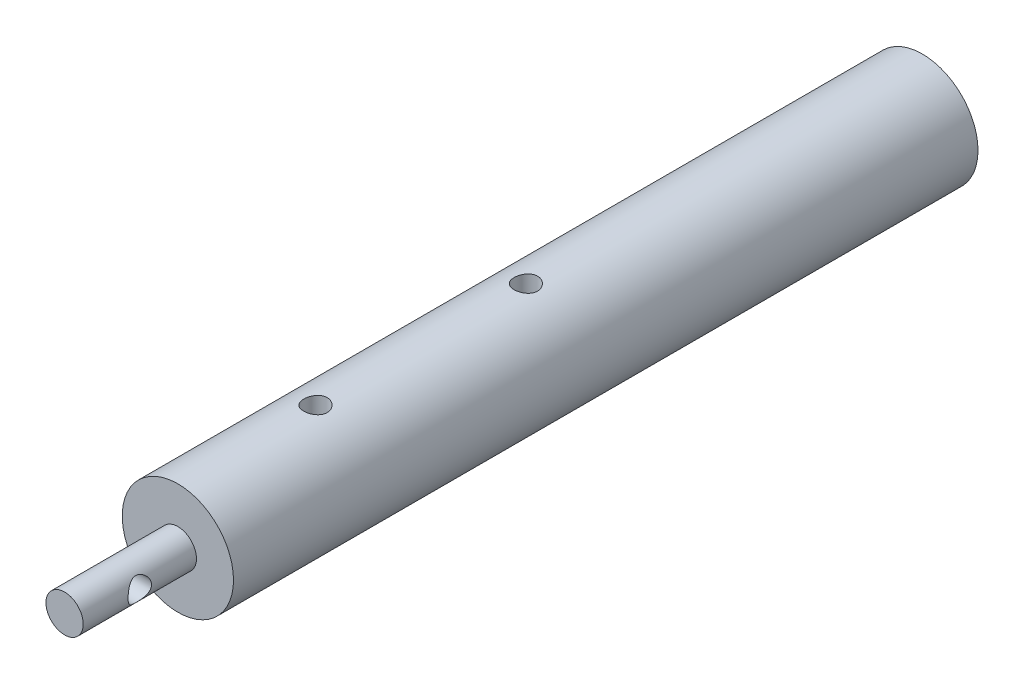
ISO-10303-21;
HEADER;
FILE_DESCRIPTION(('STEP AP214'),'2;1');
FILE_NAME('part.step','',(''),(''),'','','');
FILE_SCHEMA(('AUTOMOTIVE_DESIGN { 1 0 10303 214 1 1 1 1 }'));
ENDSEC;
DATA;
#1=APPLICATION_CONTEXT('core data for automotive mechanical design processes');
#2=APPLICATION_PROTOCOL_DEFINITION('international standard','automotive_design',2000,#1);
#3=PRODUCT_CONTEXT('',#1,'mechanical');
#4=PRODUCT('Part','Part','',(#3));
#5=PRODUCT_RELATED_PRODUCT_CATEGORY('part','',(#4));
#6=PRODUCT_DEFINITION_FORMATION('','',#4);
#7=PRODUCT_DEFINITION_CONTEXT('part definition',#1,'design');
#8=PRODUCT_DEFINITION('design','',#6,#7);
#9=PRODUCT_DEFINITION_SHAPE('','',#8);
#10=(LENGTH_UNIT() NAMED_UNIT(*) SI_UNIT(.MILLI.,.METRE.));
#11=(NAMED_UNIT(*) PLANE_ANGLE_UNIT() SI_UNIT($,.RADIAN.));
#12=(NAMED_UNIT(*) SI_UNIT($,.STERADIAN.) SOLID_ANGLE_UNIT());
#13=UNCERTAINTY_MEASURE_WITH_UNIT(LENGTH_MEASURE(1.E-05),#10,'distance_accuracy_value','');
#14=(GEOMETRIC_REPRESENTATION_CONTEXT(3) GLOBAL_UNCERTAINTY_ASSIGNED_CONTEXT((#13)) GLOBAL_UNIT_ASSIGNED_CONTEXT((#10,
#11,#12)) REPRESENTATION_CONTEXT('',''));
#15=CARTESIAN_POINT('',(0.,0.,0.));
#16=DIRECTION('',(0.,0.,1.));
#17=DIRECTION('',(1.,0.,0.));
#18=AXIS2_PLACEMENT_3D('',#15,#16,#17);
#19=CARTESIAN_POINT('',(0.,0.,116.84));
#20=DIRECTION('',(0.,0.,-1.));
#21=DIRECTION('',(-1.,0.,0.));
#22=AXIS2_PLACEMENT_3D('',#19,#20,#21);
#23=CYLINDRICAL_SURFACE('',#22,8.73125);
#24=CARTESIAN_POINT('',(0.,-8.73125,64.0715));
#25=CARTESIAN_POINT('',(0.102224418980661,-8.73124810767345,64.0714963883452));
#26=CARTESIAN_POINT('',(0.204493324141475,-8.72943643184458,64.0629593058333));
#27=CARTESIAN_POINT('',(0.406132282969961,-8.72238417957108,64.0290684180449));
#28=CARTESIAN_POINT('',(0.505500107960738,-8.7171410358242,64.003702021479));
#29=CARTESIAN_POINT('',(0.698393117145374,-8.70381035477737,63.9369775265614));
#30=CARTESIAN_POINT('',(0.791924078911132,-8.69572568446575,63.8956355427818));
#31=CARTESIAN_POINT('',(0.970717513249947,-8.67758720821655,63.7981831932263));
#32=CARTESIAN_POINT('',(1.05598031771531,-8.66753348136788,63.7420734205807));
#33=CARTESIAN_POINT('',(1.21709893146464,-8.64639208160256,63.6157881310304));
#34=CARTESIAN_POINT('',(1.292813111792,-8.63529234170806,63.5454339231176));
#35=CARTESIAN_POINT('',(1.43145789776887,-8.61339612215577,63.3930407018612));
#36=CARTESIAN_POINT('',(1.49438742595083,-8.6025996681244,63.3110007046506));
#37=CARTESIAN_POINT('',(1.60629202240899,-8.58241397100292,63.1365296780583));
#38=CARTESIAN_POINT('',(1.65511807798338,-8.57304021861435,63.0440011212156));
#39=CARTESIAN_POINT('',(1.73647441961172,-8.55693370414506,62.8518224511457));
#40=CARTESIAN_POINT('',(1.7690065079655,-8.55020064999067,62.7521731269511));
#41=CARTESIAN_POINT('',(1.8163869073972,-8.5402604397764,62.550112670628));
#42=CARTESIAN_POINT('',(1.83148501994123,-8.53700352874128,62.4477626124957));
#43=CARTESIAN_POINT('',(1.84434526749937,-8.53423479739085,62.2419343585075));
#44=CARTESIAN_POINT('',(1.84210937910246,-8.53472255007301,62.1384562926217));
#45=CARTESIAN_POINT('',(1.8205665209328,-8.53934292180432,61.9351537628666));
#46=CARTESIAN_POINT('',(1.80154809109239,-8.54341393140987,61.8352971130801));
#47=CARTESIAN_POINT('',(1.74743642668265,-8.5546448812519,61.6402243992061));
#48=CARTESIAN_POINT('',(1.71234234733093,-8.5618049838204,61.5450085792873));
#49=CARTESIAN_POINT('',(1.62680613418456,-8.57846904041817,61.3611004972115));
#50=CARTESIAN_POINT('',(1.57625159508328,-8.58799006026289,61.2724621256921));
#51=CARTESIAN_POINT('',(1.46130867134572,-8.60829249964807,61.1048193075035));
#52=CARTESIAN_POINT('',(1.39691852692361,-8.61907407944275,61.0258160883595));
#53=CARTESIAN_POINT('',(1.25459731805001,-8.64094827123213,60.8780233503252));
#54=CARTESIAN_POINT('',(1.176420502819,-8.65204278364511,60.8094705469998));
#55=CARTESIAN_POINT('',(1.0095565967994,-8.67309532179032,60.6864118575011));
#56=CARTESIAN_POINT('',(0.920869340681758,-8.68305332964051,60.6319061923317));
#57=CARTESIAN_POINT('',(0.735224260155671,-8.70073970366194,60.538436832276));
#58=CARTESIAN_POINT('',(0.638251245594517,-8.70846385578048,60.4995024595499));
#59=CARTESIAN_POINT('',(0.438940760989118,-8.72078063834335,60.4385454706627));
#60=CARTESIAN_POINT('',(0.33660401710987,-8.72537369151622,60.4165205715091));
#61=CARTESIAN_POINT('',(0.131503090262895,-8.73085114846451,60.3903481091019));
#62=CARTESIAN_POINT('',(0.0287819416933287,-8.73180267590541,60.3858769403062));
#63=CARTESIAN_POINT('',(-0.175939518626164,-8.73007726004999,60.3940641406405));
#64=CARTESIAN_POINT('',(-0.277939875261671,-8.72740054473136,60.4067214335173));
#65=CARTESIAN_POINT('',(-0.477264200163102,-8.71876160956828,60.448537684106));
#66=CARTESIAN_POINT('',(-0.574625025812075,-8.71283288585851,60.4775284856934));
#67=CARTESIAN_POINT('',(-0.763102752941739,-8.69835290497853,60.5510034042524));
#68=CARTESIAN_POINT('',(-0.854219148221811,-8.68980143550412,60.5954887755073));
#69=CARTESIAN_POINT('',(-1.02897110557119,-8.6708581812456,60.699375316947));
#70=CARTESIAN_POINT('',(-1.11248988582192,-8.66044324287773,60.7589686168857));
#71=CARTESIAN_POINT('',(-1.26845798005791,-8.63897852535916,60.8911245767354));
#72=CARTESIAN_POINT('',(-1.34090596224562,-8.62792867004874,60.9636887947505));
#73=CARTESIAN_POINT('',(-1.47394239097813,-8.60621002799416,61.1212068450163));
#74=CARTESIAN_POINT('',(-1.53430755164463,-8.59555095174663,61.2063508394186));
#75=CARTESIAN_POINT('',(-1.6398815281773,-8.57603691727207,61.3857592586653));
#76=CARTESIAN_POINT('',(-1.68509098187427,-8.56718188312773,61.4800232994755));
#77=CARTESIAN_POINT('',(-1.7587764447072,-8.5523590959474,61.6745011173867));
#78=CARTESIAN_POINT('',(-1.78734378517964,-8.54637561646805,61.7746790331107));
#79=CARTESIAN_POINT('',(-1.82720599528633,-8.53794281209472,61.9785544668625));
#80=CARTESIAN_POINT('',(-1.83850340590103,-8.53549296728869,62.0822514648209));
#81=CARTESIAN_POINT('',(-1.84340288658471,-8.53443592497005,62.287974359038));
#82=CARTESIAN_POINT('',(-1.83735844664865,-8.53575196361079,62.3899916033532));
#83=CARTESIAN_POINT('',(-1.80853174328838,-8.54190569195831,62.5915193964664));
#84=CARTESIAN_POINT('',(-1.78574964917167,-8.54674334604265,62.6910299706098));
#85=CARTESIAN_POINT('',(-1.72425961360023,-8.55935911151716,62.8844627705908));
#86=CARTESIAN_POINT('',(-1.68559966296454,-8.56712835647353,62.978400868438));
#87=CARTESIAN_POINT('',(-1.59349389952196,-8.58473602231361,63.1585112965107));
#88=CARTESIAN_POINT('',(-1.54004667269059,-8.59457464105838,63.2446828830229));
#89=CARTESIAN_POINT('',(-1.41869615361482,-8.61544418701768,63.4085643673644));
#90=CARTESIAN_POINT('',(-1.35053948384372,-8.62649408489264,63.4860842644118));
#91=CARTESIAN_POINT('',(-1.20222250645023,-8.64841003830733,63.628702962722));
#92=CARTESIAN_POINT('',(-1.12205943679128,-8.65927605090295,63.693798898032));
#93=CARTESIAN_POINT('',(-0.95085890952808,-8.67975265978602,63.8104579983337));
#94=CARTESIAN_POINT('',(-0.859703598331964,-8.68934681159678,63.8618512409825));
#95=CARTESIAN_POINT('',(-0.66986877331742,-8.70603518115298,63.9485065587661));
#96=CARTESIAN_POINT('',(-0.571195859754685,-8.71313156179671,63.9837825982221));
#97=CARTESIAN_POINT('',(-0.393641664841692,-8.72271023553425,64.0306806106957));
#98=CARTESIAN_POINT('',(-0.315743316721788,-8.72589328452023,64.0459595066134));
#99=CARTESIAN_POINT('',(-0.158572200396158,-8.73016386021864,64.0663704059581));
#100=CARTESIAN_POINT('',(-0.0792994854502548,-8.73125146795182,64.0715028017021));
#101=CARTESIAN_POINT('',(0.,-8.73125,64.0715));
#102=B_SPLINE_CURVE_WITH_KNOTS('',3,(#24,#25,#26,#27,#28,#29,#30,#31,#32,#33,#34,#35,#36,#37,
#38,#39,#40,#41,#42,#43,#44,#45,#46,#47,#48,#49,#50,#51,#52,#53,#54,#55,#56,#57,#58,#59,#60,#61,
#62,#63,#64,#65,#66,#67,#68,#69,#70,#71,#72,#73,#74,#75,#76,#77,#78,#79,#80,#81,#82,#83,#84,#85,
#86,#87,#88,#89,#90,#91,#92,#93,#94,#95,#96,#97,#98,#99,#100,#101),.UNSPECIFIED.,.T.,.F.,(4,2,2,
2,2,2,2,2,2,2,2,2,2,2,2,2,2,2,2,2,2,2,2,2,2,2,2,2,2,2,2,2,2,2,2,2,2,2,4),(0.,0.306383061294553,
0.612995609943539,0.919299682510307,1.22559145462387,1.53599448875214,1.84642367224884,
2.16002188211216,2.47358539674869,2.78259799648031,3.09157536015064,3.39534181706548,
3.69912423887161,4.00517004688789,4.31125480471567,4.62348048174754,4.9357110707361,
5.24852688079171,5.5613004493292,5.86828013860674,6.17524053995809,6.47909701178003,
6.78297808646087,7.09093661151831,7.39893215432955,7.71217945070383,8.02541356235078,
8.33691205591122,8.64836471328165,8.95351421257695,9.25866062521573,9.56289144211262,
9.86715136096092,10.1771434416111,10.4872069448623,10.8009532983934,11.1144272968432,
11.352109827303,11.5897831675244),.UNSPECIFIED.);
#103=CARTESIAN_POINT('',(0.,-8.73125,64.0715));
#104=VERTEX_POINT('',#103);
#105=EDGE_CURVE('E58',#104,#104,#102,.T.);
#106=ORIENTED_EDGE('',*,*,#105,.T.);
#107=EDGE_LOOP('',(#106));
#108=FACE_BOUND('',#107,.T.);
#109=CARTESIAN_POINT('',(0.,8.73125,64.0715));
#110=CARTESIAN_POINT('',(-0.102224418980661,8.73124810767344,64.0714963883452));
#111=CARTESIAN_POINT('',(-0.204493324141475,8.72943643184458,64.0629593058333));
#112=CARTESIAN_POINT('',(-0.406132282969961,8.72238417957108,64.0290684180449));
#113=CARTESIAN_POINT('',(-0.505500107960738,8.7171410358242,64.003702021479));
#114=CARTESIAN_POINT('',(-0.698393117145374,8.70381035477737,63.9369775265614));
#115=CARTESIAN_POINT('',(-0.791924078911132,8.69572568446575,63.8956355427818));
#116=CARTESIAN_POINT('',(-0.970717513249947,8.67758720821655,63.7981831932263));
#117=CARTESIAN_POINT('',(-1.05598031771531,8.66753348136788,63.7420734205807));
#118=CARTESIAN_POINT('',(-1.21709893146464,8.64639208160256,63.6157881310304));
#119=CARTESIAN_POINT('',(-1.292813111792,8.63529234170806,63.5454339231176));
#120=CARTESIAN_POINT('',(-1.43145789776887,8.61339612215578,63.3930407018612));
#121=CARTESIAN_POINT('',(-1.49438742595083,8.6025996681244,63.3110007046506));
#122=CARTESIAN_POINT('',(-1.60629202240899,8.58241397100292,63.1365296780583));
#123=CARTESIAN_POINT('',(-1.65511807798338,8.57304021861435,63.0440011212156));
#124=CARTESIAN_POINT('',(-1.73647441961172,8.55693370414506,62.8518224511457));
#125=CARTESIAN_POINT('',(-1.7690065079655,8.55020064999067,62.7521731269511));
#126=CARTESIAN_POINT('',(-1.8163869073972,8.5402604397764,62.550112670628));
#127=CARTESIAN_POINT('',(-1.83148501994123,8.53700352874128,62.4477626124957));
#128=CARTESIAN_POINT('',(-1.84434526749937,8.53423479739085,62.2419343585075));
#129=CARTESIAN_POINT('',(-1.84210937910246,8.53472255007301,62.1384562926217));
#130=CARTESIAN_POINT('',(-1.8205665209328,8.53934292180432,61.9351537628666));
#131=CARTESIAN_POINT('',(-1.80154809109239,8.54341393140987,61.8352971130801));
#132=CARTESIAN_POINT('',(-1.74743642668265,8.5546448812519,61.6402243992061));
#133=CARTESIAN_POINT('',(-1.71234234733093,8.5618049838204,61.5450085792873));
#134=CARTESIAN_POINT('',(-1.62680613418456,8.57846904041817,61.3611004972115));
#135=CARTESIAN_POINT('',(-1.57625159508328,8.58799006026289,61.2724621256921));
#136=CARTESIAN_POINT('',(-1.46130867134572,8.60829249964807,61.1048193075035));
#137=CARTESIAN_POINT('',(-1.39691852692361,8.61907407944275,61.0258160883595));
#138=CARTESIAN_POINT('',(-1.25459731805001,8.64094827123213,60.8780233503252));
#139=CARTESIAN_POINT('',(-1.176420502819,8.65204278364511,60.8094705469998));
#140=CARTESIAN_POINT('',(-1.0095565967994,8.67309532179032,60.6864118575011));
#141=CARTESIAN_POINT('',(-0.920869340681758,8.68305332964051,60.6319061923317));
#142=CARTESIAN_POINT('',(-0.735224260155671,8.70073970366194,60.538436832276));
#143=CARTESIAN_POINT('',(-0.638251245594517,8.70846385578048,60.4995024595499));
#144=CARTESIAN_POINT('',(-0.438940760989118,8.72078063834335,60.4385454706627));
#145=CARTESIAN_POINT('',(-0.33660401710987,8.72537369151622,60.4165205715091));
#146=CARTESIAN_POINT('',(-0.131503090262895,8.73085114846451,60.3903481091019));
#147=CARTESIAN_POINT('',(-0.0287819416933287,8.73180267590541,60.3858769403062));
#148=CARTESIAN_POINT('',(0.175939518626164,8.73007726004999,60.3940641406405));
#149=CARTESIAN_POINT('',(0.277939875261671,8.72740054473136,60.4067214335173));
#150=CARTESIAN_POINT('',(0.477264200163102,8.71876160956828,60.448537684106));
#151=CARTESIAN_POINT('',(0.574625025812075,8.71283288585851,60.4775284856934));
#152=CARTESIAN_POINT('',(0.763102752941739,8.69835290497853,60.5510034042524));
#153=CARTESIAN_POINT('',(0.854219148221811,8.68980143550412,60.5954887755073));
#154=CARTESIAN_POINT('',(1.02897110557119,8.6708581812456,60.699375316947));
#155=CARTESIAN_POINT('',(1.11248988582192,8.66044324287773,60.7589686168857));
#156=CARTESIAN_POINT('',(1.26845798005791,8.63897852535916,60.8911245767354));
#157=CARTESIAN_POINT('',(1.34090596224562,8.62792867004874,60.9636887947505));
#158=CARTESIAN_POINT('',(1.47394239097813,8.60621002799416,61.1212068450163));
#159=CARTESIAN_POINT('',(1.53430755164463,8.59555095174663,61.2063508394186));
#160=CARTESIAN_POINT('',(1.6398815281773,8.57603691727207,61.3857592586653));
#161=CARTESIAN_POINT('',(1.68509098187427,8.56718188312773,61.4800232994755));
#162=CARTESIAN_POINT('',(1.7587764447072,8.5523590959474,61.6745011173867));
#163=CARTESIAN_POINT('',(1.78734378517964,8.54637561646805,61.7746790331107));
#164=CARTESIAN_POINT('',(1.82720599528633,8.53794281209472,61.9785544668625));
#165=CARTESIAN_POINT('',(1.83850340590103,8.53549296728869,62.0822514648209));
#166=CARTESIAN_POINT('',(1.84340288658471,8.53443592497005,62.287974359038));
#167=CARTESIAN_POINT('',(1.83735844664865,8.53575196361079,62.3899916033532));
#168=CARTESIAN_POINT('',(1.80853174328838,8.54190569195831,62.5915193964664));
#169=CARTESIAN_POINT('',(1.78574964917167,8.54674334604265,62.6910299706098));
#170=CARTESIAN_POINT('',(1.72425961360023,8.55935911151716,62.8844627705908));
#171=CARTESIAN_POINT('',(1.68559966296454,8.56712835647353,62.978400868438));
#172=CARTESIAN_POINT('',(1.59349389952196,8.58473602231361,63.1585112965107));
#173=CARTESIAN_POINT('',(1.54004667269059,8.59457464105838,63.2446828830229));
#174=CARTESIAN_POINT('',(1.41869615361482,8.61544418701768,63.4085643673644));
#175=CARTESIAN_POINT('',(1.35053948384372,8.62649408489264,63.4860842644118));
#176=CARTESIAN_POINT('',(1.20222250645023,8.64841003830733,63.628702962722));
#177=CARTESIAN_POINT('',(1.12205943679128,8.65927605090295,63.693798898032));
#178=CARTESIAN_POINT('',(0.95085890952808,8.67975265978602,63.8104579983337));
#179=CARTESIAN_POINT('',(0.859703598331964,8.68934681159678,63.8618512409825));
#180=CARTESIAN_POINT('',(0.66986877331742,8.70603518115298,63.9485065587661));
#181=CARTESIAN_POINT('',(0.571195859754685,8.71313156179671,63.9837825982221));
#182=CARTESIAN_POINT('',(0.393641664841692,8.72271023553425,64.0306806106957));
#183=CARTESIAN_POINT('',(0.315743316721788,8.72589328452023,64.0459595066134));
#184=CARTESIAN_POINT('',(0.158572200396158,8.73016386021864,64.0663704059581));
#185=CARTESIAN_POINT('',(0.0792994854502548,8.73125146795182,64.0715028017021));
#186=CARTESIAN_POINT('',(0.,8.73125,64.0715));
#187=B_SPLINE_CURVE_WITH_KNOTS('',3,(#109,#110,#111,#112,#113,#114,#115,#116,#117,#118,#119,
#120,#121,#122,#123,#124,#125,#126,#127,#128,#129,#130,#131,#132,#133,#134,#135,#136,#137,#138,
#139,#140,#141,#142,#143,#144,#145,#146,#147,#148,#149,#150,#151,#152,#153,#154,#155,#156,#157,
#158,#159,#160,#161,#162,#163,#164,#165,#166,#167,#168,#169,#170,#171,#172,#173,#174,#175,#176,
#177,#178,#179,#180,#181,#182,#183,#184,#185,#186),.UNSPECIFIED.,.T.,.F.,(4,2,2,2,2,2,2,2,2,2,2,
2,2,2,2,2,2,2,2,2,2,2,2,2,2,2,2,2,2,2,2,2,2,2,2,2,2,2,4),(0.,0.306383061294552,
0.612995609943539,0.919299682510307,1.22559145462387,1.53599448875214,1.84642367224884,
2.16002188211216,2.47358539674869,2.78259799648031,3.09157536015064,3.39534181706548,
3.69912423887161,4.00517004688789,4.31125480471567,4.62348048174754,4.9357110707361,
5.24852688079171,5.5613004493292,5.86828013860674,6.17524053995809,6.47909701178003,
6.78297808646087,7.09093661151831,7.39893215432955,7.71217945070383,8.02541356235078,
8.33691205591122,8.64836471328165,8.95351421257695,9.25866062521573,9.56289144211262,
9.86715136096092,10.1771434416111,10.4872069448623,10.8009532983934,11.1144272968432,
11.352109827303,11.5897831675244),.UNSPECIFIED.);
#188=CARTESIAN_POINT('',(0.,8.73125,64.0715));
#189=VERTEX_POINT('',#188);
#190=EDGE_CURVE('E63',#189,#189,#187,.T.);
#191=ORIENTED_EDGE('',*,*,#190,.T.);
#192=EDGE_LOOP('',(#191));
#193=FACE_BOUND('',#192,.T.);
#194=CARTESIAN_POINT('',(0.,-8.73125,97.0915));
#195=CARTESIAN_POINT('',(0.102224418980661,-8.73124810767345,97.0914963883452));
#196=CARTESIAN_POINT('',(0.204493324141475,-8.72943643184458,97.0829593058333));
#197=CARTESIAN_POINT('',(0.406132282969959,-8.72238417957107,97.0490684180449));
#198=CARTESIAN_POINT('',(0.505500107960736,-8.7171410358242,97.023702021479));
#199=CARTESIAN_POINT('',(0.698393117145372,-8.70381035477737,96.9569775265614));
#200=CARTESIAN_POINT('',(0.79192407891113,-8.69572568446575,96.9156355427818));
#201=CARTESIAN_POINT('',(0.970717513249945,-8.67758720821654,96.8181831932263));
#202=CARTESIAN_POINT('',(1.05598031771531,-8.66753348136788,96.7620734205807));
#203=CARTESIAN_POINT('',(1.21709893146463,-8.64639208160256,96.6357881310304));
#204=CARTESIAN_POINT('',(1.29281311179199,-8.63529234170806,96.5654339231176));
#205=CARTESIAN_POINT('',(1.43145789776885,-8.61339612215578,96.4130407018612));
#206=CARTESIAN_POINT('',(1.49438742595082,-8.6025996681244,96.3310007046506));
#207=CARTESIAN_POINT('',(1.60629202240898,-8.58241397100292,96.1565296780583));
#208=CARTESIAN_POINT('',(1.65511807798337,-8.57304021861435,96.0640011212156));
#209=CARTESIAN_POINT('',(1.73647441961171,-8.55693370414506,95.8718224511457));
#210=CARTESIAN_POINT('',(1.76900650796549,-8.55020064999067,95.7721731269511));
#211=CARTESIAN_POINT('',(1.81638690739719,-8.5402604397764,95.570112670628));
#212=CARTESIAN_POINT('',(1.83148501994123,-8.53700352874128,95.4677626124957));
#213=CARTESIAN_POINT('',(1.84434526749936,-8.53423479739085,95.2619343585075));
#214=CARTESIAN_POINT('',(1.84210937910246,-8.53472255007301,95.1584562926217));
#215=CARTESIAN_POINT('',(1.82056652093279,-8.53934292180432,94.9551537628666));
#216=CARTESIAN_POINT('',(1.80154809109239,-8.54341393140987,94.8552971130801));
#217=CARTESIAN_POINT('',(1.74743642668264,-8.5546448812519,94.6602243992061));
#218=CARTESIAN_POINT('',(1.71234234733092,-8.5618049838204,94.5650085792873));
#219=CARTESIAN_POINT('',(1.62680613418455,-8.57846904041817,94.3811004972115));
#220=CARTESIAN_POINT('',(1.57625159508327,-8.58799006026289,94.2924621256921));
#221=CARTESIAN_POINT('',(1.46130867134571,-8.60829249964807,94.1248193075035));
#222=CARTESIAN_POINT('',(1.39691852692361,-8.61907407944275,94.0458160883595));
#223=CARTESIAN_POINT('',(1.25459731805,-8.64094827123213,93.8980233503252));
#224=CARTESIAN_POINT('',(1.17642050281899,-8.65204278364511,93.8294705469999));
#225=CARTESIAN_POINT('',(1.00955659679939,-8.67309532179032,93.7064118575011));
#226=CARTESIAN_POINT('',(0.920869340681751,-8.68305332964051,93.6519061923317));
#227=CARTESIAN_POINT('',(0.735224260155667,-8.70073970366194,93.558436832276));
#228=CARTESIAN_POINT('',(0.638251245594514,-8.70846385578048,93.5195024595499));
#229=CARTESIAN_POINT('',(0.438940760989118,-8.72078063834335,93.4585454706628));
#230=CARTESIAN_POINT('',(0.336604017109871,-8.72537369151622,93.4365205715091));
#231=CARTESIAN_POINT('',(0.131503090262897,-8.73085114846451,93.4103481091019));
#232=CARTESIAN_POINT('',(0.0287819416933311,-8.73180267590541,93.4058769403062));
#233=CARTESIAN_POINT('',(-0.175939518626164,-8.73007726004999,93.4140641406405));
#234=CARTESIAN_POINT('',(-0.277939875261672,-8.72740054473136,93.4267214335173));
#235=CARTESIAN_POINT('',(-0.477264200163101,-8.71876160956828,93.4685376841061));
#236=CARTESIAN_POINT('',(-0.574625025812071,-8.71283288585851,93.4975284856934));
#237=CARTESIAN_POINT('',(-0.763102752941733,-8.69835290497854,93.5710034042524));
#238=CARTESIAN_POINT('',(-0.854219148221807,-8.68980143550412,93.6154887755073));
#239=CARTESIAN_POINT('',(-1.02897110557118,-8.6708581812456,93.7193753169471));
#240=CARTESIAN_POINT('',(-1.11248988582192,-8.66044324287773,93.7789686168857));
#241=CARTESIAN_POINT('',(-1.26845798005791,-8.63897852535916,93.9111245767354));
#242=CARTESIAN_POINT('',(-1.34090596224561,-8.62792867004873,93.9836887947505));
#243=CARTESIAN_POINT('',(-1.47394239097813,-8.60621002799416,94.1412068450163));
#244=CARTESIAN_POINT('',(-1.53430755164462,-8.59555095174663,94.2263508394186));
#245=CARTESIAN_POINT('',(-1.63988152817729,-8.57603691727207,94.4057592586652));
#246=CARTESIAN_POINT('',(-1.68509098187427,-8.56718188312773,94.5000232994755));
#247=CARTESIAN_POINT('',(-1.7587764447072,-8.5523590959474,94.6945011173867));
#248=CARTESIAN_POINT('',(-1.78734378517963,-8.54637561646805,94.7946790331107));
#249=CARTESIAN_POINT('',(-1.82720599528633,-8.53794281209473,94.9985544668625));
#250=CARTESIAN_POINT('',(-1.83850340590102,-8.53549296728869,95.1022514648209));
#251=CARTESIAN_POINT('',(-1.8434028865847,-8.53443592497005,95.307974359038));
#252=CARTESIAN_POINT('',(-1.83735844664865,-8.53575196361079,95.4099916033532));
#253=CARTESIAN_POINT('',(-1.80853174328837,-8.54190569195831,95.6115193964664));
#254=CARTESIAN_POINT('',(-1.78574964917166,-8.54674334604265,95.7110299706098));
#255=CARTESIAN_POINT('',(-1.72425961360022,-8.55935911151716,95.9044627705908));
#256=CARTESIAN_POINT('',(-1.68559966296454,-8.56712835647353,95.998400868438));
#257=CARTESIAN_POINT('',(-1.59349389952196,-8.58473602231361,96.1785112965107));
#258=CARTESIAN_POINT('',(-1.54004667269059,-8.59457464105838,96.2646828830229));
#259=CARTESIAN_POINT('',(-1.41869615361481,-8.61544418701768,96.4285643673644));
#260=CARTESIAN_POINT('',(-1.35053948384372,-8.62649408489264,96.5060842644118));
#261=CARTESIAN_POINT('',(-1.20222250645023,-8.64841003830733,96.648702962722));
#262=CARTESIAN_POINT('',(-1.12205943679128,-8.65927605090295,96.713798898032));
#263=CARTESIAN_POINT('',(-0.950858909528077,-8.67975265978602,96.8304579983337));
#264=CARTESIAN_POINT('',(-0.859703598331959,-8.68934681159678,96.8818512409824));
#265=CARTESIAN_POINT('',(-0.669868773317414,-8.70603518115298,96.9685065587661));
#266=CARTESIAN_POINT('',(-0.571195859754682,-8.71313156179672,97.0037825982221));
#267=CARTESIAN_POINT('',(-0.393641664841691,-8.72271023553425,97.0506806106957));
#268=CARTESIAN_POINT('',(-0.315743316721787,-8.72589328452023,97.0659595066134));
#269=CARTESIAN_POINT('',(-0.158572200396158,-8.73016386021864,97.086370405958));
#270=CARTESIAN_POINT('',(-0.0792994854502546,-8.73125146795182,97.0915028017021));
#271=CARTESIAN_POINT('',(0.,-8.73125,97.0915));
#272=B_SPLINE_CURVE_WITH_KNOTS('',3,(#194,#195,#196,#197,#198,#199,#200,#201,#202,#203,#204,
#205,#206,#207,#208,#209,#210,#211,#212,#213,#214,#215,#216,#217,#218,#219,#220,#221,#222,#223,
#224,#225,#226,#227,#228,#229,#230,#231,#232,#233,#234,#235,#236,#237,#238,#239,#240,#241,#242,
#243,#244,#245,#246,#247,#248,#249,#250,#251,#252,#253,#254,#255,#256,#257,#258,#259,#260,#261,
#262,#263,#264,#265,#266,#267,#268,#269,#270,#271),.UNSPECIFIED.,.T.,.F.,(4,2,2,2,2,2,2,2,2,2,2,
2,2,2,2,2,2,2,2,2,2,2,2,2,2,2,2,2,2,2,2,2,2,2,2,2,2,2,4),(0.,0.306383061294552,
0.612995609943537,0.919299682510305,1.22559145462387,1.53599448875211,1.84642367224883,
2.16002188211214,2.47358539674867,2.7825979964803,3.09157536015062,3.39534181706549,
3.6991242388716,4.00517004688788,4.31125480471566,4.62348048174753,4.93571107073608,
5.24852688079169,5.56130044932917,5.86828013860672,6.17524053995807,6.47909701178,
6.78297808646085,7.09093661151829,7.39893215432952,7.7121794507038,8.02541356235075,
8.33691205591119,8.64836471328162,8.95351421257693,9.25866062521571,9.56289144211257,
9.86715136096089,10.177143441611,10.4872069448622,10.8009532983934,11.1144272968432,
11.3521098273029,11.5897831675244),.UNSPECIFIED.);
#273=CARTESIAN_POINT('',(0.,-8.73125,97.0915));
#274=VERTEX_POINT('',#273);
#275=EDGE_CURVE('E96',#274,#274,#272,.T.);
#276=ORIENTED_EDGE('',*,*,#275,.T.);
#277=EDGE_LOOP('',(#276));
#278=FACE_BOUND('',#277,.T.);
#279=CARTESIAN_POINT('',(0.,8.73125,97.0915));
#280=CARTESIAN_POINT('',(-0.102224418980661,8.73124810767344,97.0914963883452));
#281=CARTESIAN_POINT('',(-0.204493324141475,8.72943643184458,97.0829593058333));
#282=CARTESIAN_POINT('',(-0.406132282969959,8.72238417957108,97.0490684180449));
#283=CARTESIAN_POINT('',(-0.505500107960736,8.7171410358242,97.023702021479));
#284=CARTESIAN_POINT('',(-0.698393117145372,8.70381035477737,96.9569775265614));
#285=CARTESIAN_POINT('',(-0.791924078911129,8.69572568446575,96.9156355427818));
#286=CARTESIAN_POINT('',(-0.970717513249945,8.67758720821655,96.8181831932263));
#287=CARTESIAN_POINT('',(-1.05598031771531,8.66753348136788,96.7620734205807));
#288=CARTESIAN_POINT('',(-1.21709893146464,8.64639208160256,96.6357881310304));
#289=CARTESIAN_POINT('',(-1.292813111792,8.63529234170806,96.5654339231176));
#290=CARTESIAN_POINT('',(-1.43145789776886,8.61339612215578,96.4130407018612));
#291=CARTESIAN_POINT('',(-1.49438742595083,8.6025996681244,96.3310007046506));
#292=CARTESIAN_POINT('',(-1.60629202240898,8.58241397100292,96.1565296780583));
#293=CARTESIAN_POINT('',(-1.65511807798337,8.57304021861435,96.0640011212156));
#294=CARTESIAN_POINT('',(-1.73647441961172,8.55693370414506,95.8718224511457));
#295=CARTESIAN_POINT('',(-1.76900650796549,8.55020064999067,95.772173126951));
#296=CARTESIAN_POINT('',(-1.81638690739719,8.5402604397764,95.570112670628));
#297=CARTESIAN_POINT('',(-1.83148501994123,8.53700352874128,95.4677626124957));
#298=CARTESIAN_POINT('',(-1.84434526749936,8.53423479739085,95.2619343585075));
#299=CARTESIAN_POINT('',(-1.84210937910246,8.53472255007301,95.1584562926217));
#300=CARTESIAN_POINT('',(-1.82056652093279,8.53934292180432,94.9551537628666));
#301=CARTESIAN_POINT('',(-1.80154809109239,8.54341393140987,94.8552971130801));
#302=CARTESIAN_POINT('',(-1.74743642668264,8.5546448812519,94.6602243992061));
#303=CARTESIAN_POINT('',(-1.71234234733092,8.5618049838204,94.5650085792873));
#304=CARTESIAN_POINT('',(-1.62680613418455,8.57846904041817,94.3811004972115));
#305=CARTESIAN_POINT('',(-1.57625159508327,8.58799006026289,94.2924621256921));
#306=CARTESIAN_POINT('',(-1.46130867134571,8.60829249964807,94.1248193075035));
#307=CARTESIAN_POINT('',(-1.39691852692361,8.61907407944275,94.0458160883595));
#308=CARTESIAN_POINT('',(-1.25459731805,8.64094827123213,93.8980233503252));
#309=CARTESIAN_POINT('',(-1.17642050281899,8.65204278364511,93.8294705469999));
#310=CARTESIAN_POINT('',(-1.0095565967994,8.67309532179032,93.7064118575011));
#311=CARTESIAN_POINT('',(-0.920869340681753,8.68305332964051,93.6519061923317));
#312=CARTESIAN_POINT('',(-0.735224260155666,8.70073970366194,93.558436832276));
#313=CARTESIAN_POINT('',(-0.638251245594514,8.70846385578048,93.5195024595499));
#314=CARTESIAN_POINT('',(-0.438940760989118,8.72078063834335,93.4585454706628));
#315=CARTESIAN_POINT('',(-0.33660401710987,8.72537369151622,93.4365205715091));
#316=CARTESIAN_POINT('',(-0.131503090262897,8.73085114846451,93.4103481091019));
#317=CARTESIAN_POINT('',(-0.0287819416933309,8.73180267590541,93.4058769403062));
#318=CARTESIAN_POINT('',(0.175939518626164,8.73007726004999,93.4140641406405));
#319=CARTESIAN_POINT('',(0.277939875261672,8.72740054473136,93.4267214335173));
#320=CARTESIAN_POINT('',(0.477264200163101,8.71876160956828,93.4685376841061));
#321=CARTESIAN_POINT('',(0.574625025812071,8.71283288585851,93.4975284856934));
#322=CARTESIAN_POINT('',(0.763102752941733,8.69835290497854,93.5710034042524));
#323=CARTESIAN_POINT('',(0.854219148221806,8.68980143550412,93.6154887755073));
#324=CARTESIAN_POINT('',(1.02897110557118,8.6708581812456,93.7193753169471));
#325=CARTESIAN_POINT('',(1.11248988582191,8.66044324287773,93.7789686168857));
#326=CARTESIAN_POINT('',(1.2684579800579,8.63897852535916,93.9111245767354));
#327=CARTESIAN_POINT('',(1.34090596224561,8.62792867004874,93.9836887947505));
#328=CARTESIAN_POINT('',(1.47394239097813,8.60621002799416,94.1412068450163));
#329=CARTESIAN_POINT('',(1.53430755164462,8.59555095174663,94.2263508394186));
#330=CARTESIAN_POINT('',(1.63988152817729,8.57603691727207,94.4057592586652));
#331=CARTESIAN_POINT('',(1.68509098187427,8.56718188312773,94.5000232994755));
#332=CARTESIAN_POINT('',(1.7587764447072,8.5523590959474,94.6945011173867));
#333=CARTESIAN_POINT('',(1.78734378517963,8.54637561646805,94.7946790331107));
#334=CARTESIAN_POINT('',(1.82720599528633,8.53794281209473,94.9985544668625));
#335=CARTESIAN_POINT('',(1.83850340590102,8.53549296728869,95.1022514648209));
#336=CARTESIAN_POINT('',(1.8434028865847,8.53443592497005,95.307974359038));
#337=CARTESIAN_POINT('',(1.83735844664865,8.53575196361079,95.4099916033532));
#338=CARTESIAN_POINT('',(1.80853174328837,8.54190569195831,95.6115193964664));
#339=CARTESIAN_POINT('',(1.78574964917166,8.54674334604265,95.7110299706098));
#340=CARTESIAN_POINT('',(1.72425961360022,8.55935911151716,95.9044627705908));
#341=CARTESIAN_POINT('',(1.68559966296454,8.56712835647353,95.998400868438));
#342=CARTESIAN_POINT('',(1.59349389952196,8.58473602231361,96.1785112965107));
#343=CARTESIAN_POINT('',(1.54004667269059,8.59457464105838,96.2646828830229));
#344=CARTESIAN_POINT('',(1.41869615361481,8.61544418701768,96.4285643673644));
#345=CARTESIAN_POINT('',(1.35053948384372,8.62649408489264,96.5060842644118));
#346=CARTESIAN_POINT('',(1.20222250645023,8.64841003830733,96.648702962722));
#347=CARTESIAN_POINT('',(1.12205943679128,8.65927605090295,96.713798898032));
#348=CARTESIAN_POINT('',(0.950858909528077,8.67975265978602,96.8304579983337));
#349=CARTESIAN_POINT('',(0.859703598331959,8.68934681159678,96.8818512409824));
#350=CARTESIAN_POINT('',(0.669868773317415,8.70603518115298,96.9685065587661));
#351=CARTESIAN_POINT('',(0.571195859754682,8.71313156179672,97.0037825982221));
#352=CARTESIAN_POINT('',(0.393641664841691,8.72271023553425,97.0506806106957));
#353=CARTESIAN_POINT('',(0.315743316721787,8.72589328452023,97.0659595066134));
#354=CARTESIAN_POINT('',(0.158572200396158,8.73016386021864,97.086370405958));
#355=CARTESIAN_POINT('',(0.0792994854502547,8.73125146795182,97.0915028017021));
#356=CARTESIAN_POINT('',(0.,8.73125,97.0915));
#357=B_SPLINE_CURVE_WITH_KNOTS('',3,(#279,#280,#281,#282,#283,#284,#285,#286,#287,#288,#289,
#290,#291,#292,#293,#294,#295,#296,#297,#298,#299,#300,#301,#302,#303,#304,#305,#306,#307,#308,
#309,#310,#311,#312,#313,#314,#315,#316,#317,#318,#319,#320,#321,#322,#323,#324,#325,#326,#327,
#328,#329,#330,#331,#332,#333,#334,#335,#336,#337,#338,#339,#340,#341,#342,#343,#344,#345,#346,
#347,#348,#349,#350,#351,#352,#353,#354,#355,#356),.UNSPECIFIED.,.T.,.F.,(4,2,2,2,2,2,2,2,2,2,2,
2,2,2,2,2,2,2,2,2,2,2,2,2,2,2,2,2,2,2,2,2,2,2,2,2,2,2,4),(0.,0.306383061294551,
0.612995609943537,0.919299682510305,1.22559145462387,1.53599448875213,1.84642367224883,
2.16002188211215,2.47358539674867,2.7825979964803,3.09157536015062,3.39534181706549,
3.6991242388716,4.00517004688788,4.31125480471566,4.62348048174752,4.93571107073608,
5.24852688079169,5.56130044932917,5.86828013860672,6.17524053995807,6.47909701178,
6.78297808646085,7.09093661151827,7.39893215432952,7.7121794507038,8.02541356235075,
8.33691205591119,8.64836471328162,8.95351421257693,9.25866062521571,9.56289144211257,
9.86715136096089,10.177143441611,10.4872069448622,10.8009532983934,11.1144272968432,
11.3521098273029,11.5897831675244),.UNSPECIFIED.);
#358=CARTESIAN_POINT('',(0.,8.73125,97.0915));
#359=VERTEX_POINT('',#358);
#360=EDGE_CURVE('E103',#359,#359,#357,.T.);
#361=ORIENTED_EDGE('',*,*,#360,.T.);
#362=EDGE_LOOP('',(#361));
#363=FACE_BOUND('',#362,.T.);
#364=CARTESIAN_POINT('',(0.,0.,116.84));
#365=DIRECTION('',(0.,0.,1.));
#366=DIRECTION('',(1.,0.,0.));
#367=AXIS2_PLACEMENT_3D('',#364,#365,#366);
#368=CIRCLE('',#367,8.73125);
#369=CARTESIAN_POINT('',(8.73125,0.,116.84));
#370=VERTEX_POINT('',#369);
#371=EDGE_CURVE('E115',#370,#370,#368,.T.);
#372=ORIENTED_EDGE('',*,*,#371,.F.);
#373=EDGE_LOOP('',(#372));
#374=FACE_BOUND('',#373,.T.);
#375=CARTESIAN_POINT('',(0.,0.,0.));
#376=DIRECTION('',(0.,0.,1.));
#377=DIRECTION('',(1.,0.,0.));
#378=AXIS2_PLACEMENT_3D('',#375,#376,#377);
#379=CIRCLE('',#378,8.73125);
#380=CARTESIAN_POINT('',(8.73125,0.,0.));
#381=VERTEX_POINT('',#380);
#382=EDGE_CURVE('E111',#381,#381,#379,.T.);
#383=ORIENTED_EDGE('',*,*,#382,.T.);
#384=EDGE_LOOP('',(#383));
#385=FACE_BOUND('',#384,.T.);
#386=ADVANCED_FACE('F44',(#108,#193,#278,#363,#374,#385),#23,.T.);
#387=CARTESIAN_POINT('',(0.,0.,116.84));
#388=DIRECTION('',(0.,0.,1.));
#389=DIRECTION('',(1.,0.,0.));
#390=AXIS2_PLACEMENT_3D('',#387,#388,#389);
#391=PLANE('',#390);
#392=CARTESIAN_POINT('',(0.,0.,116.84));
#393=DIRECTION('',(0.,0.,1.));
#394=DIRECTION('',(1.,0.,0.));
#395=AXIS2_PLACEMENT_3D('',#392,#393,#394);
#396=CIRCLE('',#395,2.921);
#397=CARTESIAN_POINT('',(2.921,0.,116.84));
#398=VERTEX_POINT('',#397);
#399=EDGE_CURVE('E110',#398,#398,#396,.T.);
#400=ORIENTED_EDGE('',*,*,#399,.F.);
#401=EDGE_LOOP('',(#400));
#402=FACE_BOUND('',#401,.T.);
#403=ORIENTED_EDGE('',*,*,#371,.T.);
#404=EDGE_LOOP('',(#403));
#405=FACE_BOUND('',#404,.T.);
#406=ADVANCED_FACE('F139',(#402,#405),#391,.T.);
#407=CARTESIAN_POINT('',(0.,0.,0.));
#408=DIRECTION('',(0.,0.,1.));
#409=DIRECTION('',(1.,0.,0.));
#410=AXIS2_PLACEMENT_3D('',#407,#408,#409);
#411=PLANE('',#410);
#412=ORIENTED_EDGE('',*,*,#382,.F.);
#413=EDGE_LOOP('',(#412));
#414=FACE_BOUND('',#413,.T.);
#415=ADVANCED_FACE('F134',(#414),#411,.F.);
#416=CARTESIAN_POINT('',(0.,0.,134.62));
#417=DIRECTION('',(0.,0.,-1.));
#418=DIRECTION('',(-1.,0.,0.));
#419=AXIS2_PLACEMENT_3D('',#416,#417,#418);
#420=CYLINDRICAL_SURFACE('',#419,2.921);
#421=CARTESIAN_POINT('',(-2.921,0.,127.5715));
#422=CARTESIAN_POINT('',(-2.92099286624653,-0.0934212562188345,127.571492232104));
#423=CARTESIAN_POINT('',(-2.91647139925894,-0.186949440554949,127.564342621983));
#424=CARTESIAN_POINT('',(-2.89881186966268,-0.371122809160821,127.536130489425));
#425=CARTESIAN_POINT('',(-2.88565847086671,-0.461762560504622,127.515043203708));
#426=CARTESIAN_POINT('',(-2.85205639181536,-0.637142495452705,127.460194607178));
#427=CARTESIAN_POINT('',(-2.83164379831481,-0.721909426919586,127.42649594714));
#428=CARTESIAN_POINT('',(-2.78521501633373,-0.884285161154267,127.347810608321));
#429=CARTESIAN_POINT('',(-2.75919929153218,-0.961894555475076,127.302824863536));
#430=CARTESIAN_POINT('',(-2.70122665351075,-1.11482216013085,127.198850409912));
#431=CARTESIAN_POINT('',(-2.66895995658433,-1.18945210280222,127.139025570582));
#432=CARTESIAN_POINT('',(-2.60265854351978,-1.32828545886827,127.009000955298));
#433=CARTESIAN_POINT('',(-2.5686214699466,-1.39247447436301,126.938787103436));
#434=CARTESIAN_POINT('',(-2.49697420166683,-1.5176438081631,126.778617533621));
#435=CARTESIAN_POINT('',(-2.45952080122013,-1.57695286588197,126.687274491865));
#436=CARTESIAN_POINT('',(-2.39087479261429,-1.6792145954495,126.49373178692));
#437=CARTESIAN_POINT('',(-2.3596715886284,-1.72219506168414,126.391550954537));
#438=CARTESIAN_POINT('',(-2.31568340952093,-1.78068048032257,126.20652493824));
#439=CARTESIAN_POINT('',(-2.30021243000036,-1.80043931720192,126.125667466873));
#440=CARTESIAN_POINT('',(-2.27767969847057,-1.82886745232628,125.960927643009));
#441=CARTESIAN_POINT('',(-2.27060574488411,-1.83755284257402,125.877049862463));
#442=CARTESIAN_POINT('',(-2.2659358212476,-1.84331045833951,125.70838699943));
#443=CARTESIAN_POINT('',(-2.26836625390227,-1.84035033306617,125.623600042919));
#444=CARTESIAN_POINT('',(-2.28237099230025,-1.82294797600448,125.455960059189));
#445=CARTESIAN_POINT('',(-2.29395271070558,-1.80849643595848,125.373108655832));
#446=CARTESIAN_POINT('',(-2.3241855850145,-1.76945880383033,125.21354767847));
#447=CARTESIAN_POINT('',(-2.34265067073303,-1.74513808243485,125.13673579951));
#448=CARTESIAN_POINT('',(-2.38461549298461,-1.6873418708903,124.9881348524));
#449=CARTESIAN_POINT('',(-2.40811699877895,-1.65386316245503,124.916347561143));
#450=CARTESIAN_POINT('',(-2.46287487642798,-1.57142333576371,124.765384260081));
#451=CARTESIAN_POINT('',(-2.49475712688805,-1.52073120522297,124.687381213493));
#452=CARTESIAN_POINT('',(-2.55979524702774,-1.40851175643451,124.540125854175));
#453=CARTESIAN_POINT('',(-2.59295241306724,-1.34697316860366,124.470882772945));
#454=CARTESIAN_POINT('',(-2.66345638529202,-1.2023969808662,124.331025831683));
#455=CARTESIAN_POINT('',(-2.70055011040669,-1.11748250222311,124.262202183235));
#456=CARTESIAN_POINT('',(-2.76896719049517,-0.935160797473528,124.139833706759));
#457=CARTESIAN_POINT('',(-2.80029258656547,-0.837758011070932,124.086283470608));
#458=CARTESIAN_POINT('',(-2.8522519752847,-0.63795700689955,123.999284931655));
#459=CARTESIAN_POINT('',(-2.87335413540834,-0.536075685991607,123.964942151469));
#460=CARTESIAN_POINT('',(-2.90463931110013,-0.326337146650083,123.914452699831));
#461=CARTESIAN_POINT('',(-2.9148383387253,-0.218488936706457,123.898279343454));
#462=CARTESIAN_POINT('',(-2.92240896332343,-0.0176609273216063,123.886263533642));
#463=CARTESIAN_POINT('',(-2.92148578445616,0.0751034465311029,123.887718567011));
#464=CARTESIAN_POINT('',(-2.91096042757494,0.258865392657876,123.904454581065));
#465=CARTESIAN_POINT('',(-2.901358952807,0.349863107482891,123.919734441455));
#466=CARTESIAN_POINT('',(-2.87496965639714,0.523638482875281,123.962347436366));
#467=CARTESIAN_POINT('',(-2.85850591706062,0.606601208671017,123.989138505266));
#468=CARTESIAN_POINT('',(-2.81977392870971,0.766753077619426,124.053495988035));
#469=CARTESIAN_POINT('',(-2.7975047384512,0.843941281928493,124.091064149305));
#470=CARTESIAN_POINT('',(-2.74627997559262,0.998740282583476,124.180035317876));
#471=CARTESIAN_POINT('',(-2.71687849946953,1.07562174391673,124.232446006971));
#472=CARTESIAN_POINT('',(-2.65517580857222,1.22002555882843,124.347537936121));
#473=CARTESIAN_POINT('',(-2.62287144717348,1.28753754960807,124.410230383458));
#474=CARTESIAN_POINT('',(-2.55296327817677,1.42166992823977,124.55480058151));
#475=CARTESIAN_POINT('',(-2.51528319192326,1.4866773996451,124.63814460657));
#476=CARTESIAN_POINT('',(-2.44342085622955,1.60204695851987,124.815796855663));
#477=CARTESIAN_POINT('',(-2.40923651040742,1.65241785726175,124.910098435136));
#478=CARTESIAN_POINT('',(-2.35541832507103,1.72798709702656,125.087762441728));
#479=CARTESIAN_POINT('',(-2.33423732528,1.75623749667252,125.169350612994));
#480=CARTESIAN_POINT('',(-2.29971936489155,1.80120672133926,125.33719267375));
#481=CARTESIAN_POINT('',(-2.28636993170159,1.81794388976702,125.423438904206));
#482=CARTESIAN_POINT('',(-2.26949986933562,1.83896936275437,125.598982961153));
#483=CARTESIAN_POINT('',(-2.26604024788137,1.84318040326375,125.688296303998));
#484=CARTESIAN_POINT('',(-2.2697550263183,1.83860248402341,125.866380893968));
#485=CARTESIAN_POINT('',(-2.27693222078657,1.82981010792832,125.955151992476));
#486=CARTESIAN_POINT('',(-2.29960564724072,1.80120510503775,126.121512171929));
#487=CARTESIAN_POINT('',(-2.31431278807477,1.78243223140698,126.199397159637));
#488=CARTESIAN_POINT('',(-2.34970683854201,1.73550536512324,126.350834041934));
#489=CARTESIAN_POINT('',(-2.37039634604632,1.7073472960917,126.424384037291));
#490=CARTESIAN_POINT('',(-2.41898961355456,1.63791437395591,126.576341937779));
#491=CARTESIAN_POINT('',(-2.44750025026691,1.59534610516838,126.653960939036));
#492=CARTESIAN_POINT('',(-2.50700615597796,1.50010705748101,126.801699035843));
#493=CARTESIAN_POINT('',(-2.53800338468926,1.44742826391349,126.871812112255));
#494=CARTESIAN_POINT('',(-2.60648216542313,1.32085777399696,127.017468054652));
#495=CARTESIAN_POINT('',(-2.64398671226838,1.24483150100655,127.09116393245));
#496=CARTESIAN_POINT('',(-2.71541390015625,1.08020378909145,127.225179869555));
#497=CARTESIAN_POINT('',(-2.74933408227473,0.991593814002084,127.285490777394));
#498=CARTESIAN_POINT('',(-2.81043355757391,0.802270064629673,127.391113253011));
#499=CARTESIAN_POINT('',(-2.8375439202393,0.701446726586048,127.436272882572));
#500=CARTESIAN_POINT('',(-2.87037510331394,0.544128389437607,127.490149874788));
#501=CARTESIAN_POINT('',(-2.88000792464097,0.490726069438397,127.50579056781));
#502=CARTESIAN_POINT('',(-2.8963884887735,0.382319456503978,127.532236894514));
#503=CARTESIAN_POINT('',(-2.90313829621803,0.327316340215585,127.543045988553));
#504=CARTESIAN_POINT('',(-2.91251843788057,0.226953273323917,127.558023923537));
#505=CARTESIAN_POINT('',(-2.91569129378268,0.181772541003873,127.563069891151));
#506=CARTESIAN_POINT('',(-2.91993387554584,0.091069691489346,127.569809921293));
#507=CARTESIAN_POINT('',(-2.9210034780631,0.0455475544305628,127.571503787239));
#508=CARTESIAN_POINT('',(-2.921,0.,127.5715));
#509=B_SPLINE_CURVE_WITH_KNOTS('',3,(#421,#422,#423,#424,#425,#426,#427,#428,#429,#430,#431,
#432,#433,#434,#435,#436,#437,#438,#439,#440,#441,#442,#443,#444,#445,#446,#447,#448,#449,#450,
#451,#452,#453,#454,#455,#456,#457,#458,#459,#460,#461,#462,#463,#464,#465,#466,#467,#468,#469,
#470,#471,#472,#473,#474,#475,#476,#477,#478,#479,#480,#481,#482,#483,#484,#485,#486,#487,#488,
#489,#490,#491,#492,#493,#494,#495,#496,#497,#498,#499,#500,#501,#502,#503,#504,#505,#506,#507,
#508),.UNSPECIFIED.,.T.,.F.,(4,2,2,2,2,2,2,2,2,2,2,2,2,2,2,2,2,2,2,2,2,2,2,2,2,2,2,2,2,2,2,2,2,
2,2,2,2,2,2,2,2,2,2,4),(0.,0.280080820575564,0.560660607483342,0.839864644051663,
1.11904558436857,1.42071756045858,1.72280207464863,2.0666614406044,2.40993284127874,
2.66287159467121,2.91544235533166,3.16871524254194,3.42219349470047,3.66926536702842,
3.91642417677755,4.21035998990711,4.50460302538433,4.84916000850503,5.19359483646721,
5.52026159252795,5.84644795245971,6.1233523889239,6.40023438843868,6.66530324407069,
6.93041510236395,7.22203306399862,7.51397103269586,7.84914624969039,8.18411926990046,
8.4497775314919,8.71501154769788,8.98187823063518,9.24881503904479,9.49222141900369,
9.7357336584914,10.0137587014405,10.2920050534753,10.6274538353871,10.9631312659599,
11.3020807493125,11.4712499167681,11.6402977316108,11.776843191153,11.9133966580668),.UNSPECIFIED.);
#510=CARTESIAN_POINT('',(-2.921,0.,127.5715));
#511=VERTEX_POINT('',#510);
#512=EDGE_CURVE('E48',#511,#511,#509,.T.);
#513=ORIENTED_EDGE('',*,*,#512,.T.);
#514=EDGE_LOOP('',(#513));
#515=FACE_BOUND('',#514,.T.);
#516=CARTESIAN_POINT('',(2.921,0.,123.8885));
#517=CARTESIAN_POINT('',(2.92099286624653,-0.0934212562188351,123.888507767896));
#518=CARTESIAN_POINT('',(2.91647139925894,-0.186949440554949,123.895657378017));
#519=CARTESIAN_POINT('',(2.89881186966268,-0.371122809160822,123.923869510575));
#520=CARTESIAN_POINT('',(2.88565847086671,-0.461762560504622,123.944956796292));
#521=CARTESIAN_POINT('',(2.85205639181536,-0.637142495452702,123.999805392822));
#522=CARTESIAN_POINT('',(2.83164379831481,-0.721909426919579,124.03350405286));
#523=CARTESIAN_POINT('',(2.78521501633374,-0.884285161154259,124.112189391679));
#524=CARTESIAN_POINT('',(2.75919929153218,-0.961894555475068,124.157175136464));
#525=CARTESIAN_POINT('',(2.70122665351075,-1.11482216013085,124.261149590088));
#526=CARTESIAN_POINT('',(2.66895995658433,-1.18945210280223,124.320974429418));
#527=CARTESIAN_POINT('',(2.60265854351978,-1.32828545886828,124.450999044702));
#528=CARTESIAN_POINT('',(2.5686214699466,-1.39247447436302,124.521212896564));
#529=CARTESIAN_POINT('',(2.49697420166683,-1.51764380816311,124.681382466379));
#530=CARTESIAN_POINT('',(2.45952080122013,-1.57695286588198,124.772725508135));
#531=CARTESIAN_POINT('',(2.39087479261429,-1.6792145954495,124.96626821308));
#532=CARTESIAN_POINT('',(2.35967158862839,-1.72219506168414,125.068449045463));
#533=CARTESIAN_POINT('',(2.31568340952093,-1.78068048032257,125.25347506176));
#534=CARTESIAN_POINT('',(2.30021243000036,-1.80043931720192,125.334332533127));
#535=CARTESIAN_POINT('',(2.27767969847057,-1.82886745232628,125.499072356991));
#536=CARTESIAN_POINT('',(2.27060574488411,-1.83755284257402,125.582950137537));
#537=CARTESIAN_POINT('',(2.2659358212476,-1.84331045833951,125.75161300057));
#538=CARTESIAN_POINT('',(2.26836625390227,-1.84035033306617,125.836399957081));
#539=CARTESIAN_POINT('',(2.28237099230025,-1.82294797600449,126.004039940811));
#540=CARTESIAN_POINT('',(2.29395271070557,-1.80849643595848,126.086891344168));
#541=CARTESIAN_POINT('',(2.32418558501449,-1.76945880383034,126.246452321529));
#542=CARTESIAN_POINT('',(2.34265067073303,-1.74513808243485,126.32326420049));
#543=CARTESIAN_POINT('',(2.38461549298461,-1.6873418708903,126.4718651476));
#544=CARTESIAN_POINT('',(2.40811699877895,-1.65386316245503,126.543652438857));
#545=CARTESIAN_POINT('',(2.46287487642798,-1.57142333576371,126.694615739919));
#546=CARTESIAN_POINT('',(2.49475712688805,-1.52073120522298,126.772618786507));
#547=CARTESIAN_POINT('',(2.55979524702775,-1.40851175643451,126.919874145825));
#548=CARTESIAN_POINT('',(2.59295241306725,-1.34697316860365,126.989117227055));
#549=CARTESIAN_POINT('',(2.66345638529203,-1.2023969808662,127.128974168316));
#550=CARTESIAN_POINT('',(2.70055011040669,-1.11748250222311,127.197797816765));
#551=CARTESIAN_POINT('',(2.76896719049517,-0.935160797473539,127.320166293241));
#552=CARTESIAN_POINT('',(2.80029258656546,-0.837758011070947,127.373716529392));
#553=CARTESIAN_POINT('',(2.8522519752847,-0.637957006899569,127.460715068345));
#554=CARTESIAN_POINT('',(2.87335413540833,-0.536075685991626,127.495057848531));
#555=CARTESIAN_POINT('',(2.90463931110012,-0.3263371466501,127.545547300169));
#556=CARTESIAN_POINT('',(2.91483833872529,-0.218488936706472,127.561720656546));
#557=CARTESIAN_POINT('',(2.92240896332343,-0.0176609273216206,127.573736466358));
#558=CARTESIAN_POINT('',(2.92148578445616,0.0751034465310885,127.572281432989));
#559=CARTESIAN_POINT('',(2.91096042757494,0.258865392657863,127.555545418935));
#560=CARTESIAN_POINT('',(2.901358952807,0.349863107482879,127.540265558545));
#561=CARTESIAN_POINT('',(2.87496965639714,0.523638482875272,127.497652563634));
#562=CARTESIAN_POINT('',(2.85850591706062,0.606601208671008,127.470861494734));
#563=CARTESIAN_POINT('',(2.81977392870972,0.766753077619417,127.406504011965));
#564=CARTESIAN_POINT('',(2.7975047384512,0.843941281928483,127.368935850695));
#565=CARTESIAN_POINT('',(2.74627997559262,0.998740282583473,127.279964682124));
#566=CARTESIAN_POINT('',(2.71687849946953,1.07562174391674,127.227553993029));
#567=CARTESIAN_POINT('',(2.65517580857221,1.22002555882843,127.112462063879));
#568=CARTESIAN_POINT('',(2.62287144717348,1.28753754960807,127.049769616542));
#569=CARTESIAN_POINT('',(2.55296327817678,1.42166992823976,126.90519941849));
#570=CARTESIAN_POINT('',(2.51528319192327,1.48667739964509,126.82185539343));
#571=CARTESIAN_POINT('',(2.44342085622955,1.60204695851986,126.644203144337));
#572=CARTESIAN_POINT('',(2.40923651040742,1.65241785726174,126.549901564864));
#573=CARTESIAN_POINT('',(2.35541832507103,1.72798709702656,126.372237558272));
#574=CARTESIAN_POINT('',(2.33423732528,1.75623749667252,126.290649387006));
#575=CARTESIAN_POINT('',(2.29971936489154,1.80120672133927,126.12280732625));
#576=CARTESIAN_POINT('',(2.28636993170159,1.81794388976702,126.036561095794));
#577=CARTESIAN_POINT('',(2.26949986933562,1.83896936275437,125.861017038847));
#578=CARTESIAN_POINT('',(2.26604024788137,1.84318040326376,125.771703696002));
#579=CARTESIAN_POINT('',(2.2697550263183,1.83860248402341,125.593619106032));
#580=CARTESIAN_POINT('',(2.27693222078657,1.82981010792831,125.504848007524));
#581=CARTESIAN_POINT('',(2.29960564724073,1.80120510503773,125.338487828071));
#582=CARTESIAN_POINT('',(2.31431278807478,1.78243223140696,125.260602840363));
#583=CARTESIAN_POINT('',(2.34970683854202,1.73550536512322,125.109165958066));
#584=CARTESIAN_POINT('',(2.37039634604633,1.70734729609168,125.035615962709));
#585=CARTESIAN_POINT('',(2.41898961355458,1.63791437395588,124.883658062221));
#586=CARTESIAN_POINT('',(2.44750025026693,1.59534610516836,124.806039060964));
#587=CARTESIAN_POINT('',(2.50700615597798,1.50010705748098,124.658300964157));
#588=CARTESIAN_POINT('',(2.53800338468928,1.44742826391346,124.588187887745));
#589=CARTESIAN_POINT('',(2.60648216542315,1.32085777399691,124.442531945348));
#590=CARTESIAN_POINT('',(2.6439867122684,1.2448315010065,124.36883606755));
#591=CARTESIAN_POINT('',(2.71541390015627,1.08020378909139,124.234820130445));
#592=CARTESIAN_POINT('',(2.74933408227475,0.991593814002033,124.174509222606));
#593=CARTESIAN_POINT('',(2.81043355757392,0.802270064629618,124.068886746989));
#594=CARTESIAN_POINT('',(2.83754392023932,0.701446726585989,124.023727117428));
#595=CARTESIAN_POINT('',(2.87037510331396,0.544128389437545,123.969850125212));
#596=CARTESIAN_POINT('',(2.88000792464098,0.490726069438334,123.95420943219));
#597=CARTESIAN_POINT('',(2.89638848877351,0.382319456503915,123.927763105486));
#598=CARTESIAN_POINT('',(2.90313829621804,0.327316340215521,123.916954011447));
#599=CARTESIAN_POINT('',(2.91251843788057,0.226953273323863,123.901976076463));
#600=CARTESIAN_POINT('',(2.91569129378268,0.181772541003832,123.896930108849));
#601=CARTESIAN_POINT('',(2.91993387554584,0.0910696914893265,123.890190078707));
#602=CARTESIAN_POINT('',(2.9210034780631,0.0455475544305529,123.888496212761));
#603=CARTESIAN_POINT('',(2.921,0.,123.8885));
#604=B_SPLINE_CURVE_WITH_KNOTS('',3,(#516,#517,#518,#519,#520,#521,#522,#523,#524,#525,#526,
#527,#528,#529,#530,#531,#532,#533,#534,#535,#536,#537,#538,#539,#540,#541,#542,#543,#544,#545,
#546,#547,#548,#549,#550,#551,#552,#553,#554,#555,#556,#557,#558,#559,#560,#561,#562,#563,#564,
#565,#566,#567,#568,#569,#570,#571,#572,#573,#574,#575,#576,#577,#578,#579,#580,#581,#582,#583,
#584,#585,#586,#587,#588,#589,#590,#591,#592,#593,#594,#595,#596,#597,#598,#599,#600,#601,#602,
#603),.UNSPECIFIED.,.T.,.F.,(4,2,2,2,2,2,2,2,2,2,2,2,2,2,2,2,2,2,2,2,2,2,2,2,2,2,2,2,2,2,2,2,2,
2,2,2,2,2,2,2,2,2,2,4),(0.,0.280080820575564,0.560660607483337,0.839864644051648,
1.11904558436858,1.4207175604586,1.72280207464864,2.06666144060442,2.40993284127874,
2.66287159467121,2.91544235533166,3.16871524254192,3.42219349470044,3.66926536702839,
3.91642417677755,4.21035998990711,4.50460302538434,4.84916000850504,5.19359483646719,
5.52026159252794,5.8464479524597,6.12335238892389,6.40023438843867,6.66530324407068,
6.93041510236395,7.22203306399864,7.51397103269586,7.84914624969038,8.18411926990045,
8.44977753149189,8.7150115476979,8.98187823063523,9.24881503904484,9.49222141900374,
9.73573365849145,10.0137587014406,10.2920050534754,10.6274538353872,10.96313126596,
11.3020807493125,11.4712499167681,11.6402977316109,11.776843191153,11.9133966580668),.UNSPECIFIED.);
#605=CARTESIAN_POINT('',(2.921,0.,123.8885));
#606=VERTEX_POINT('',#605);
#607=EDGE_CURVE('E10',#606,#606,#604,.T.);
#608=ORIENTED_EDGE('',*,*,#607,.T.);
#609=EDGE_LOOP('',(#608));
#610=FACE_BOUND('',#609,.T.);
#611=CARTESIAN_POINT('',(0.,0.,134.62));
#612=DIRECTION('',(0.,0.,1.));
#613=DIRECTION('',(1.,0.,0.));
#614=AXIS2_PLACEMENT_3D('',#611,#612,#613);
#615=CIRCLE('',#614,2.921);
#616=CARTESIAN_POINT('',(2.921,0.,134.62));
#617=VERTEX_POINT('',#616);
#618=EDGE_CURVE('E116',#617,#617,#615,.T.);
#619=ORIENTED_EDGE('',*,*,#618,.F.);
#620=EDGE_LOOP('',(#619));
#621=FACE_BOUND('',#620,.T.);
#622=ORIENTED_EDGE('',*,*,#399,.T.);
#623=EDGE_LOOP('',(#622));
#624=FACE_BOUND('',#623,.T.);
#625=ADVANCED_FACE('F73',(#515,#610,#621,#624),#420,.T.);
#626=CARTESIAN_POINT('',(0.,0.,134.62));
#627=DIRECTION('',(0.,0.,1.));
#628=DIRECTION('',(1.,0.,0.));
#629=AXIS2_PLACEMENT_3D('',#626,#627,#628);
#630=PLANE('',#629);
#631=ORIENTED_EDGE('',*,*,#618,.T.);
#632=EDGE_LOOP('',(#631));
#633=FACE_BOUND('',#632,.T.);
#634=ADVANCED_FACE('F133',(#633),#630,.T.);
#635=CARTESIAN_POINT('',(0.,-8.73125,95.25));
#636=DIRECTION('',(0.,1.,0.));
#637=DIRECTION('',(0.,0.,1.));
#638=AXIS2_PLACEMENT_3D('',#635,#636,#637);
#639=CYLINDRICAL_SURFACE('',#638,1.84149999999999);
#640=ORIENTED_EDGE('',*,*,#360,.F.);
#641=EDGE_LOOP('',(#640));
#642=FACE_BOUND('',#641,.T.);
#643=ORIENTED_EDGE('',*,*,#275,.F.);
#644=EDGE_LOOP('',(#643));
#645=FACE_BOUND('',#644,.T.);
#646=ADVANCED_FACE('F86',(#642,#645),#639,.F.);
#647=CARTESIAN_POINT('',(0.,-8.73125,62.23));
#648=DIRECTION('',(0.,1.,0.));
#649=DIRECTION('',(0.,0.,1.));
#650=AXIS2_PLACEMENT_3D('',#647,#648,#649);
#651=CYLINDRICAL_SURFACE('',#650,1.8415);
#652=ORIENTED_EDGE('',*,*,#190,.F.);
#653=EDGE_LOOP('',(#652));
#654=FACE_BOUND('',#653,.T.);
#655=ORIENTED_EDGE('',*,*,#105,.F.);
#656=EDGE_LOOP('',(#655));
#657=FACE_BOUND('',#656,.T.);
#658=ADVANCED_FACE('F80',(#654,#657),#651,.F.);
#659=CARTESIAN_POINT('',(-8.73125,0.,125.73));
#660=DIRECTION('',(1.,0.,0.));
#661=DIRECTION('',(0.,0.,-1.));
#662=AXIS2_PLACEMENT_3D('',#659,#660,#661);
#663=CYLINDRICAL_SURFACE('',#662,1.84149999999999);
#664=ORIENTED_EDGE('',*,*,#512,.F.);
#665=EDGE_LOOP('',(#664));
#666=FACE_BOUND('',#665,.T.);
#667=ORIENTED_EDGE('',*,*,#607,.F.);
#668=EDGE_LOOP('',(#667));
#669=FACE_BOUND('',#668,.T.);
#670=ADVANCED_FACE('F77',(#666,#669),#663,.F.);
#671=CLOSED_SHELL('',(#386,#406,#415,#625,#634,#646,#658,#670));
#672=MANIFOLD_SOLID_BREP('B2',#671);
#673=ADVANCED_BREP_SHAPE_REPRESENTATION('',(#18,#672),#14);
#674=SHAPE_DEFINITION_REPRESENTATION(#9,#673);
ENDSEC;
END-ISO-10303-21;
